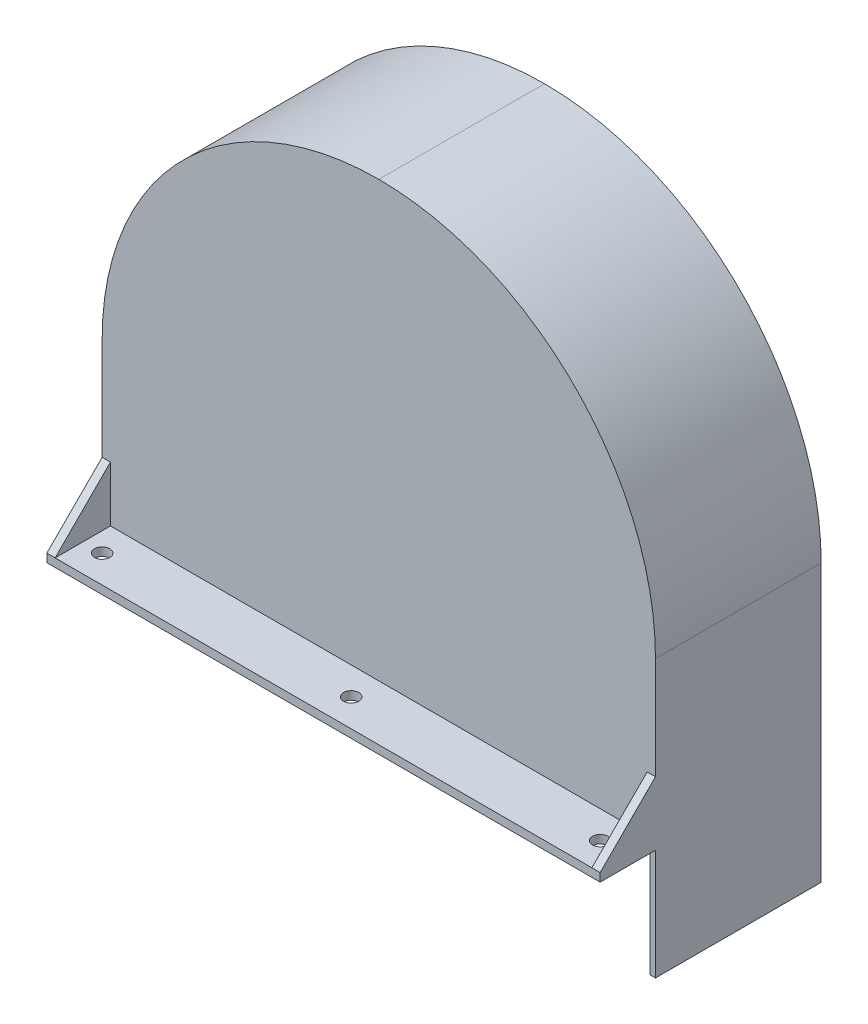
ISO-10303-21;
HEADER;
FILE_DESCRIPTION(('STEP AP214'),'2;1');
FILE_NAME('part.step','',(''),(''),'','','');
FILE_SCHEMA(('AUTOMOTIVE_DESIGN { 1 0 10303 214 1 1 1 1 }'));
ENDSEC;
DATA;
#1=APPLICATION_CONTEXT('core data for automotive mechanical design processes');
#2=APPLICATION_PROTOCOL_DEFINITION('international standard','automotive_design',2000,#1);
#3=PRODUCT_CONTEXT('',#1,'mechanical');
#4=PRODUCT('Part','Part','',(#3));
#5=PRODUCT_RELATED_PRODUCT_CATEGORY('part','',(#4));
#6=PRODUCT_DEFINITION_FORMATION('','',#4);
#7=PRODUCT_DEFINITION_CONTEXT('part definition',#1,'design');
#8=PRODUCT_DEFINITION('design','',#6,#7);
#9=PRODUCT_DEFINITION_SHAPE('','',#8);
#10=(LENGTH_UNIT() NAMED_UNIT(*) SI_UNIT(.MILLI.,.METRE.));
#11=(NAMED_UNIT(*) PLANE_ANGLE_UNIT() SI_UNIT($,.RADIAN.));
#12=(NAMED_UNIT(*) SI_UNIT($,.STERADIAN.) SOLID_ANGLE_UNIT());
#13=UNCERTAINTY_MEASURE_WITH_UNIT(LENGTH_MEASURE(1.E-05),#10,'distance_accuracy_value','');
#14=(GEOMETRIC_REPRESENTATION_CONTEXT(3) GLOBAL_UNCERTAINTY_ASSIGNED_CONTEXT((#13)) GLOBAL_UNIT_ASSIGNED_CONTEXT((#10,
#11,#12)) REPRESENTATION_CONTEXT('',''));
#15=CARTESIAN_POINT('',(0.,0.,0.));
#16=DIRECTION('',(0.,0.,1.));
#17=DIRECTION('',(1.,0.,0.));
#18=AXIS2_PLACEMENT_3D('',#15,#16,#17);
#19=CARTESIAN_POINT('',(0.,0.,0.));
#20=DIRECTION('',(0.,1.,0.));
#21=DIRECTION('',(0.,0.,1.));
#22=AXIS2_PLACEMENT_3D('',#19,#20,#21);
#23=PLANE('',#22);
#24=DIRECTION('',(0.,0.,-1.));
#25=VECTOR('',#24,1.);
#26=CARTESIAN_POINT('',(98.,0.,-29.945));
#27=LINE('',#26,#25);
#28=CARTESIAN_POINT('',(98.,0.,-27.945));
#29=VERTEX_POINT('',#28);
#30=CARTESIAN_POINT('',(98.,0.,-29.945));
#31=VERTEX_POINT('',#30);
#32=EDGE_CURVE('E11',#29,#31,#27,.T.);
#33=ORIENTED_EDGE('',*,*,#32,.F.);
#34=DIRECTION('',(-1.,0.,0.));
#35=VECTOR('',#34,1.);
#36=CARTESIAN_POINT('',(70.,0.,-27.945));
#37=LINE('',#36,#35);
#38=CARTESIAN_POINT('',(70.,0.,-27.945));
#39=VERTEX_POINT('',#38);
#40=EDGE_CURVE('E273',#29,#39,#37,.T.);
#41=ORIENTED_EDGE('',*,*,#40,.T.);
#42=DIRECTION('',(0.,0.,-1.));
#43=VECTOR('',#42,1.);
#44=CARTESIAN_POINT('',(70.,0.,-27.945));
#45=LINE('',#44,#43);
#46=CARTESIAN_POINT('',(70.,0.,-29.945));
#47=VERTEX_POINT('',#46);
#48=EDGE_CURVE('E286',#39,#47,#45,.T.);
#49=ORIENTED_EDGE('',*,*,#48,.T.);
#50=DIRECTION('',(-1.,0.,0.));
#51=VECTOR('',#50,1.);
#52=CARTESIAN_POINT('',(-100.,0.,-29.945));
#53=LINE('',#52,#51);
#54=EDGE_CURVE('E65',#31,#47,#53,.T.);
#55=ORIENTED_EDGE('',*,*,#54,.F.);
#56=EDGE_LOOP('',(#33,#41,#49,#55));
#57=FACE_BOUND('',#56,.T.);
#58=ADVANCED_FACE('F40',(#57),#23,.F.);
#59=CARTESIAN_POINT('',(0.,0.,39.945));
#60=DIRECTION('',(0.,1.,0.));
#61=DIRECTION('',(0.,0.,1.));
#62=AXIS2_PLACEMENT_3D('',#59,#60,#61);
#63=CIRCLE('',#62,2.75);
#64=CARTESIAN_POINT('',(0.,0.,42.695));
#65=VERTEX_POINT('',#64);
#66=EDGE_CURVE('E250',#65,#65,#63,.F.);
#67=ORIENTED_EDGE('',*,*,#66,.F.);
#68=EDGE_LOOP('',(#67));
#69=FACE_BOUND('',#68,.T.);
#70=CARTESIAN_POINT('',(90.,0.,39.945));
#71=DIRECTION('',(0.,1.,0.));
#72=DIRECTION('',(0.,0.,1.));
#73=AXIS2_PLACEMENT_3D('',#70,#71,#72);
#74=CIRCLE('',#73,2.75000000000001);
#75=CARTESIAN_POINT('',(90.,0.,42.695));
#76=VERTEX_POINT('',#75);
#77=EDGE_CURVE('E242',#76,#76,#74,.F.);
#78=ORIENTED_EDGE('',*,*,#77,.F.);
#79=EDGE_LOOP('',(#78));
#80=FACE_BOUND('',#79,.T.);
#81=CARTESIAN_POINT('',(-90.,0.,39.945));
#82=DIRECTION('',(0.,1.,0.));
#83=DIRECTION('',(0.,0.,1.));
#84=AXIS2_PLACEMENT_3D('',#81,#82,#83);
#85=CIRCLE('',#84,2.75000000000001);
#86=CARTESIAN_POINT('',(-90.,0.,42.695));
#87=VERTEX_POINT('',#86);
#88=EDGE_CURVE('E233',#87,#87,#85,.F.);
#89=ORIENTED_EDGE('',*,*,#88,.F.);
#90=EDGE_LOOP('',(#89));
#91=FACE_BOUND('',#90,.T.);
#92=CARTESIAN_POINT('',(98.,0.,29.945));
#93=VERTEX_POINT('',#92);
#94=CARTESIAN_POINT('',(98.,0.,27.945));
#95=VERTEX_POINT('',#94);
#96=EDGE_CURVE('E50',#93,#95,#27,.T.);
#97=ORIENTED_EDGE('',*,*,#96,.F.);
#98=DIRECTION('',(-1.,0.,0.));
#99=VECTOR('',#98,1.);
#100=CARTESIAN_POINT('',(100.,0.,29.945));
#101=LINE('',#100,#99);
#102=CARTESIAN_POINT('',(100.,0.,29.945));
#103=VERTEX_POINT('',#102);
#104=EDGE_CURVE('E57',#103,#93,#101,.T.);
#105=ORIENTED_EDGE('',*,*,#104,.F.);
#106=DIRECTION('',(0.,0.,-1.));
#107=VECTOR('',#106,1.);
#108=CARTESIAN_POINT('',(100.,0.,-29.945));
#109=LINE('',#108,#107);
#110=CARTESIAN_POINT('',(100.,0.,49.945));
#111=VERTEX_POINT('',#110);
#112=EDGE_CURVE('E229',#111,#103,#109,.T.);
#113=ORIENTED_EDGE('',*,*,#112,.F.);
#114=DIRECTION('',(1.,0.,0.));
#115=VECTOR('',#114,1.);
#116=CARTESIAN_POINT('',(100.,0.,49.945));
#117=LINE('',#116,#115);
#118=CARTESIAN_POINT('',(-100.,0.,49.945));
#119=VERTEX_POINT('',#118);
#120=EDGE_CURVE('E337',#119,#111,#117,.T.);
#121=ORIENTED_EDGE('',*,*,#120,.F.);
#122=DIRECTION('',(0.,0.,1.));
#123=VECTOR('',#122,1.);
#124=CARTESIAN_POINT('',(-100.,0.,-29.945));
#125=LINE('',#124,#123);
#126=CARTESIAN_POINT('',(-100.,0.,-29.945));
#127=VERTEX_POINT('',#126);
#128=EDGE_CURVE('E362',#127,#119,#125,.T.);
#129=ORIENTED_EDGE('',*,*,#128,.F.);
#130=CARTESIAN_POINT('',(-50.,0.,-29.945));
#131=VERTEX_POINT('',#130);
#132=EDGE_CURVE('E360',#131,#127,#53,.T.);
#133=ORIENTED_EDGE('',*,*,#132,.F.);
#134=DIRECTION('',(0.,0.,-1.));
#135=VECTOR('',#134,1.);
#136=CARTESIAN_POINT('',(-50.,0.,-27.945));
#137=LINE('',#136,#135);
#138=CARTESIAN_POINT('',(-50.,0.,-27.945));
#139=VERTEX_POINT('',#138);
#140=EDGE_CURVE('E295',#139,#131,#137,.T.);
#141=ORIENTED_EDGE('',*,*,#140,.F.);
#142=DIRECTION('',(-1.,0.,0.));
#143=VECTOR('',#142,1.);
#144=CARTESIAN_POINT('',(-50.,0.,-27.945));
#145=LINE('',#144,#143);
#146=CARTESIAN_POINT('',(-61.,0.,-27.945));
#147=VERTEX_POINT('',#146);
#148=EDGE_CURVE('E262',#139,#147,#145,.T.);
#149=ORIENTED_EDGE('',*,*,#148,.T.);
#150=DIRECTION('',(0.,0.,-1.));
#151=VECTOR('',#150,1.);
#152=CARTESIAN_POINT('',(-61.,0.,101.945000000001));
#153=LINE('',#152,#151);
#154=CARTESIAN_POINT('',(-61.,0.,27.945));
#155=VERTEX_POINT('',#154);
#156=EDGE_CURVE('E255',#155,#147,#153,.T.);
#157=ORIENTED_EDGE('',*,*,#156,.F.);
#158=DIRECTION('',(1.,0.,0.));
#159=VECTOR('',#158,1.);
#160=CARTESIAN_POINT('',(-100.,0.,27.945));
#161=LINE('',#160,#159);
#162=EDGE_CURVE('E351',#155,#95,#161,.T.);
#163=ORIENTED_EDGE('',*,*,#162,.T.);
#164=EDGE_LOOP('',(#97,#105,#113,#121,#129,#133,#141,#149,#157,#163));
#165=FACE_BOUND('',#164,.T.);
#166=ADVANCED_FACE('F439',(#69,#80,#91,#165),#23,.F.);
#167=CARTESIAN_POINT('',(0.,60.,0.));
#168=DIRECTION('',(0.,0.,-1.));
#169=DIRECTION('',(-1.,0.,0.));
#170=AXIS2_PLACEMENT_3D('',#167,#168,#169);
#171=CYLINDRICAL_SURFACE('',#170,98.);
#172=DIRECTION('',(0.,0.,-1.));
#173=VECTOR('',#172,1.);
#174=CARTESIAN_POINT('',(-97.9204405296046,63.9480788351011,0.));
#175=LINE('',#174,#173);
#176=CARTESIAN_POINT('',(-97.9204405296046,63.9480788351012,-27.945));
#177=VERTEX_POINT('',#176);
#178=CARTESIAN_POINT('',(-97.9204405296046,63.9480788351011,27.945));
#179=VERTEX_POINT('',#178);
#180=EDGE_CURVE('E259',#177,#179,#175,.F.);
#181=ORIENTED_EDGE('',*,*,#180,.F.);
#182=CARTESIAN_POINT('',(0.,60.,-27.945));
#183=DIRECTION('',(0.,0.,-1.));
#184=DIRECTION('',(-1.,0.,0.));
#185=AXIS2_PLACEMENT_3D('',#182,#183,#184);
#186=CIRCLE('',#185,98.);
#187=CARTESIAN_POINT('',(0.,158.,-27.945));
#188=VERTEX_POINT('',#187);
#189=EDGE_CURVE('E267',#177,#188,#186,.T.);
#190=ORIENTED_EDGE('',*,*,#189,.T.);
#191=DIRECTION('',(0.,0.,-1.));
#192=VECTOR('',#191,1.);
#193=CARTESIAN_POINT('',(0.,158.,0.));
#194=LINE('',#193,#192);
#195=CARTESIAN_POINT('',(0.,158.,27.945));
#196=VERTEX_POINT('',#195);
#197=EDGE_CURVE('E340',#196,#188,#194,.T.);
#198=ORIENTED_EDGE('',*,*,#197,.F.);
#199=CARTESIAN_POINT('',(0.,60.,27.945));
#200=DIRECTION('',(0.,0.,-1.));
#201=DIRECTION('',(-1.,0.,0.));
#202=AXIS2_PLACEMENT_3D('',#199,#200,#201);
#203=CIRCLE('',#202,98.);
#204=EDGE_CURVE('E346',#196,#179,#203,.F.);
#205=ORIENTED_EDGE('',*,*,#204,.T.);
#206=EDGE_LOOP('',(#181,#190,#198,#205));
#207=FACE_BOUND('',#206,.T.);
#208=ADVANCED_FACE('F498',(#207),#171,.F.);
#209=CARTESIAN_POINT('',(-100.,160.,27.945));
#210=DIRECTION('',(0.,0.,-1.));
#211=DIRECTION('',(-1.,0.,0.));
#212=AXIS2_PLACEMENT_3D('',#209,#210,#211);
#213=PLANE('',#212);
#214=ORIENTED_EDGE('',*,*,#162,.F.);
#215=DIRECTION('',(0.499999999999995,-0.866025403784442,0.));
#216=VECTOR('',#215,1.);
#217=CARTESIAN_POINT('',(-61.,0.,27.945));
#218=LINE('',#217,#216);
#219=EDGE_CURVE('E257',#179,#155,#218,.T.);
#220=ORIENTED_EDGE('',*,*,#219,.F.);
#221=ORIENTED_EDGE('',*,*,#204,.F.);
#222=CARTESIAN_POINT('',(0.,60.,27.945));
#223=DIRECTION('',(0.,0.,-1.));
#224=DIRECTION('',(-1.,0.,0.));
#225=AXIS2_PLACEMENT_3D('',#222,#223,#224);
#226=CIRCLE('',#225,98.);
#227=CARTESIAN_POINT('',(98.,60.,27.945));
#228=VERTEX_POINT('',#227);
#229=EDGE_CURVE('E350',#228,#196,#226,.F.);
#230=ORIENTED_EDGE('',*,*,#229,.F.);
#231=DIRECTION('',(0.,-1.,0.));
#232=VECTOR('',#231,1.);
#233=CARTESIAN_POINT('',(98.,160.,27.945));
#234=LINE('',#233,#232);
#235=EDGE_CURVE('E347',#228,#95,#234,.T.);
#236=ORIENTED_EDGE('',*,*,#235,.T.);
#237=EDGE_LOOP('',(#214,#220,#221,#230,#236));
#238=FACE_BOUND('',#237,.T.);
#239=ADVANCED_FACE('F528',(#238),#213,.T.);
#240=CARTESIAN_POINT('',(0.,60.,-27.945));
#241=DIRECTION('',(0.,0.,-1.));
#242=DIRECTION('',(-1.,0.,0.));
#243=AXIS2_PLACEMENT_3D('',#240,#241,#242);
#244=PLANE('',#243);
#245=DIRECTION('',(-0.499999999999995,0.866025403784441,0.));
#246=VECTOR('',#245,1.);
#247=CARTESIAN_POINT('',(-61.,0.,-27.945));
#248=LINE('',#247,#246);
#249=EDGE_CURVE('E253',#147,#177,#248,.T.);
#250=ORIENTED_EDGE('',*,*,#249,.F.);
#251=ORIENTED_EDGE('',*,*,#148,.F.);
#252=DIRECTION('',(0.,-1.,0.));
#253=VECTOR('',#252,1.);
#254=CARTESIAN_POINT('',(-50.,110.,-27.945));
#255=LINE('',#254,#253);
#256=CARTESIAN_POINT('',(-50.,90.,-27.945));
#257=VERTEX_POINT('',#256);
#258=EDGE_CURVE('E283',#257,#139,#255,.T.);
#259=ORIENTED_EDGE('',*,*,#258,.F.);
#260=CARTESIAN_POINT('',(-30.,90.,-27.945));
#261=DIRECTION('',(0.,0.,-1.));
#262=DIRECTION('',(-1.,0.,0.));
#263=AXIS2_PLACEMENT_3D('',#260,#261,#262);
#264=CIRCLE('',#263,20.);
#265=CARTESIAN_POINT('',(-30.,110.,-27.945));
#266=VERTEX_POINT('',#265);
#267=EDGE_CURVE('E406',#257,#266,#264,.T.);
#268=ORIENTED_EDGE('',*,*,#267,.T.);
#269=DIRECTION('',(-1.,0.,0.));
#270=VECTOR('',#269,1.);
#271=CARTESIAN_POINT('',(-50.,110.,-27.945));
#272=LINE('',#271,#270);
#273=CARTESIAN_POINT('',(50.,110.,-27.945));
#274=VERTEX_POINT('',#273);
#275=EDGE_CURVE('E279',#274,#266,#272,.T.);
#276=ORIENTED_EDGE('',*,*,#275,.F.);
#277=CARTESIAN_POINT('',(50.,90.,-27.945));
#278=DIRECTION('',(0.,0.,-1.));
#279=DIRECTION('',(-1.,0.,0.));
#280=AXIS2_PLACEMENT_3D('',#277,#278,#279);
#281=CIRCLE('',#280,20.);
#282=CARTESIAN_POINT('',(70.,90.,-27.945));
#283=VERTEX_POINT('',#282);
#284=EDGE_CURVE('E44',#274,#283,#281,.T.);
#285=ORIENTED_EDGE('',*,*,#284,.T.);
#286=DIRECTION('',(0.,1.,0.));
#287=VECTOR('',#286,1.);
#288=CARTESIAN_POINT('',(70.,110.,-27.945));
#289=LINE('',#288,#287);
#290=EDGE_CURVE('E276',#39,#283,#289,.T.);
#291=ORIENTED_EDGE('',*,*,#290,.F.);
#292=ORIENTED_EDGE('',*,*,#40,.F.);
#293=DIRECTION('',(0.,-1.,0.));
#294=VECTOR('',#293,1.);
#295=CARTESIAN_POINT('',(98.,0.,-27.945));
#296=LINE('',#295,#294);
#297=CARTESIAN_POINT('',(98.,60.,-27.945));
#298=VERTEX_POINT('',#297);
#299=EDGE_CURVE('E270',#298,#29,#296,.T.);
#300=ORIENTED_EDGE('',*,*,#299,.F.);
#301=EDGE_CURVE('E265',#188,#298,#186,.T.);
#302=ORIENTED_EDGE('',*,*,#301,.F.);
#303=ORIENTED_EDGE('',*,*,#189,.F.);
#304=EDGE_LOOP('',(#250,#251,#259,#268,#276,#285,#291,#292,#300,#302,#303));
#305=FACE_BOUND('',#304,.T.);
#306=ADVANCED_FACE('F416',(#305),#244,.F.);
#307=CARTESIAN_POINT('',(98.,160.,-29.945));
#308=DIRECTION('',(-1.,0.,0.));
#309=DIRECTION('',(0.,0.,1.));
#310=AXIS2_PLACEMENT_3D('',#307,#308,#309);
#311=PLANE('',#310);
#312=DIRECTION('',(0.,0.,1.));
#313=VECTOR('',#312,1.);
#314=CARTESIAN_POINT('',(98.,60.,-29.945));
#315=LINE('',#314,#313);
#316=EDGE_CURVE('E343',#298,#228,#315,.T.);
#317=ORIENTED_EDGE('',*,*,#316,.F.);
#318=ORIENTED_EDGE('',*,*,#299,.T.);
#319=ORIENTED_EDGE('',*,*,#32,.T.);
#320=DIRECTION('',(0.,1.,0.));
#321=VECTOR('',#320,1.);
#322=CARTESIAN_POINT('',(98.,-40.,-29.945));
#323=LINE('',#322,#321);
#324=CARTESIAN_POINT('',(98.,-40.,-29.945));
#325=VERTEX_POINT('',#324);
#326=EDGE_CURVE('E235',#325,#31,#323,.T.);
#327=ORIENTED_EDGE('',*,*,#326,.F.);
#328=DIRECTION('',(0.,0.,-1.));
#329=VECTOR('',#328,1.);
#330=CARTESIAN_POINT('',(98.,-40.,-29.945));
#331=LINE('',#330,#329);
#332=CARTESIAN_POINT('',(98.,-40.,29.945));
#333=VERTEX_POINT('',#332);
#334=EDGE_CURVE('E215',#333,#325,#331,.T.);
#335=ORIENTED_EDGE('',*,*,#334,.F.);
#336=DIRECTION('',(0.,1.,0.));
#337=VECTOR('',#336,1.);
#338=CARTESIAN_POINT('',(98.,-40.,29.945));
#339=LINE('',#338,#337);
#340=EDGE_CURVE('E212',#333,#93,#339,.T.);
#341=ORIENTED_EDGE('',*,*,#340,.T.);
#342=ORIENTED_EDGE('',*,*,#96,.T.);
#343=ORIENTED_EDGE('',*,*,#235,.F.);
#344=EDGE_LOOP('',(#317,#318,#319,#327,#335,#341,#342,#343));
#345=FACE_BOUND('',#344,.T.);
#346=ADVANCED_FACE('F527',(#345),#311,.T.);
#347=CARTESIAN_POINT('',(0.,60.,0.));
#348=DIRECTION('',(0.,0.,1.));
#349=DIRECTION('',(1.,0.,0.));
#350=AXIS2_PLACEMENT_3D('',#347,#348,#349);
#351=CYLINDRICAL_SURFACE('',#350,98.);
#352=ORIENTED_EDGE('',*,*,#301,.T.);
#353=ORIENTED_EDGE('',*,*,#316,.T.);
#354=ORIENTED_EDGE('',*,*,#229,.T.);
#355=ORIENTED_EDGE('',*,*,#197,.T.);
#356=EDGE_LOOP('',(#352,#353,#354,#355));
#357=FACE_BOUND('',#356,.T.);
#358=ADVANCED_FACE('F610',(#357),#351,.F.);
#359=CARTESIAN_POINT('',(100.,3.,49.945));
#360=DIRECTION('',(0.,-1.,0.));
#361=DIRECTION('',(1.,0.,0.));
#362=AXIS2_PLACEMENT_3D('',#359,#360,#361);
#363=PLANE('',#362);
#364=CARTESIAN_POINT('',(-90.,2.99999999999998,39.945));
#365=DIRECTION('',(0.,1.,0.));
#366=DIRECTION('',(-1.,0.,0.));
#367=AXIS2_PLACEMENT_3D('',#364,#365,#366);
#368=CIRCLE('',#367,2.75000000000001);
#369=CARTESIAN_POINT('',(-92.75,2.99999999999998,39.945));
#370=VERTEX_POINT('',#369);
#371=EDGE_CURVE('E230',#370,#370,#368,.T.);
#372=ORIENTED_EDGE('',*,*,#371,.F.);
#373=EDGE_LOOP('',(#372));
#374=FACE_BOUND('',#373,.T.);
#375=CARTESIAN_POINT('',(90.,3.,39.945));
#376=DIRECTION('',(0.,1.,0.));
#377=DIRECTION('',(-1.,0.,0.));
#378=AXIS2_PLACEMENT_3D('',#375,#376,#377);
#379=CIRCLE('',#378,2.75000000000001);
#380=CARTESIAN_POINT('',(87.25,3.,39.945));
#381=VERTEX_POINT('',#380);
#382=EDGE_CURVE('E239',#381,#381,#379,.T.);
#383=ORIENTED_EDGE('',*,*,#382,.F.);
#384=EDGE_LOOP('',(#383));
#385=FACE_BOUND('',#384,.T.);
#386=CARTESIAN_POINT('',(0.,2.99999999999999,39.945));
#387=DIRECTION('',(0.,1.,0.));
#388=DIRECTION('',(-1.,0.,0.));
#389=AXIS2_PLACEMENT_3D('',#386,#387,#388);
#390=CIRCLE('',#389,2.75);
#391=CARTESIAN_POINT('',(-2.75,2.99999999999999,39.945));
#392=VERTEX_POINT('',#391);
#393=EDGE_CURVE('E244',#392,#392,#390,.T.);
#394=ORIENTED_EDGE('',*,*,#393,.F.);
#395=EDGE_LOOP('',(#394));
#396=FACE_BOUND('',#395,.T.);
#397=DIRECTION('',(0.,0.,-1.));
#398=VECTOR('',#397,1.);
#399=CARTESIAN_POINT('',(-97.,2.99999999999998,29.945));
#400=LINE('',#399,#398);
#401=CARTESIAN_POINT('',(-97.,3.,49.945));
#402=VERTEX_POINT('',#401);
#403=CARTESIAN_POINT('',(-97.,2.99999999999998,29.945));
#404=VERTEX_POINT('',#403);
#405=EDGE_CURVE('E300',#402,#404,#400,.T.);
#406=ORIENTED_EDGE('',*,*,#405,.F.);
#407=DIRECTION('',(-1.,0.,0.));
#408=VECTOR('',#407,1.);
#409=CARTESIAN_POINT('',(100.,3.,49.945));
#410=LINE('',#409,#408);
#411=CARTESIAN_POINT('',(97.,3.,49.945));
#412=VERTEX_POINT('',#411);
#413=EDGE_CURVE('E330',#412,#402,#410,.T.);
#414=ORIENTED_EDGE('',*,*,#413,.F.);
#415=DIRECTION('',(0.,0.,-1.));
#416=VECTOR('',#415,1.);
#417=CARTESIAN_POINT('',(97.,2.99999999999998,29.945));
#418=LINE('',#417,#416);
#419=CARTESIAN_POINT('',(97.,2.99999999999998,29.945));
#420=VERTEX_POINT('',#419);
#421=EDGE_CURVE('E313',#412,#420,#418,.T.);
#422=ORIENTED_EDGE('',*,*,#421,.T.);
#423=DIRECTION('',(-1.,0.,0.));
#424=VECTOR('',#423,1.);
#425=CARTESIAN_POINT('',(100.,3.,29.945));
#426=LINE('',#425,#424);
#427=EDGE_CURVE('E326',#420,#404,#426,.T.);
#428=ORIENTED_EDGE('',*,*,#427,.T.);
#429=EDGE_LOOP('',(#406,#414,#422,#428));
#430=FACE_BOUND('',#429,.T.);
#431=ADVANCED_FACE('F474',(#374,#385,#396,#430),#363,.F.);
#432=CARTESIAN_POINT('',(-100.,160.,29.945));
#433=DIRECTION('',(0.,0.,-1.));
#434=DIRECTION('',(-1.,0.,0.));
#435=AXIS2_PLACEMENT_3D('',#432,#433,#434);
#436=PLANE('',#435);
#437=DIRECTION('',(-1.,0.,0.));
#438=VECTOR('',#437,1.);
#439=CARTESIAN_POINT('',(-97.,23.,29.945));
#440=LINE('',#439,#438);
#441=CARTESIAN_POINT('',(-97.,23.,29.945));
#442=VERTEX_POINT('',#441);
#443=CARTESIAN_POINT('',(-100.,23.,29.945));
#444=VERTEX_POINT('',#443);
#445=EDGE_CURVE('E308',#442,#444,#440,.T.);
#446=ORIENTED_EDGE('',*,*,#445,.F.);
#447=DIRECTION('',(0.,1.,0.));
#448=VECTOR('',#447,1.);
#449=CARTESIAN_POINT('',(-97.,23.,29.945));
#450=LINE('',#449,#448);
#451=EDGE_CURVE('E304',#404,#442,#450,.T.);
#452=ORIENTED_EDGE('',*,*,#451,.F.);
#453=ORIENTED_EDGE('',*,*,#427,.F.);
#454=DIRECTION('',(0.,1.,0.));
#455=VECTOR('',#454,1.);
#456=CARTESIAN_POINT('',(97.,23.,29.945));
#457=LINE('',#456,#455);
#458=CARTESIAN_POINT('',(97.,23.,29.945));
#459=VERTEX_POINT('',#458);
#460=EDGE_CURVE('E316',#420,#459,#457,.T.);
#461=ORIENTED_EDGE('',*,*,#460,.T.);
#462=DIRECTION('',(1.,0.,0.));
#463=VECTOR('',#462,1.);
#464=CARTESIAN_POINT('',(97.,23.,29.945));
#465=LINE('',#464,#463);
#466=CARTESIAN_POINT('',(100.,23.,29.945));
#467=VERTEX_POINT('',#466);
#468=EDGE_CURVE('E321',#459,#467,#465,.T.);
#469=ORIENTED_EDGE('',*,*,#468,.T.);
#470=DIRECTION('',(0.,-1.,0.));
#471=VECTOR('',#470,1.);
#472=CARTESIAN_POINT('',(100.,160.,29.945));
#473=LINE('',#472,#471);
#474=CARTESIAN_POINT('',(100.,60.,29.945));
#475=VERTEX_POINT('',#474);
#476=EDGE_CURVE('E364',#475,#467,#473,.T.);
#477=ORIENTED_EDGE('',*,*,#476,.F.);
#478=CARTESIAN_POINT('',(0.,60.,29.945));
#479=DIRECTION('',(0.,0.,-1.));
#480=DIRECTION('',(-1.,0.,0.));
#481=AXIS2_PLACEMENT_3D('',#478,#479,#480);
#482=CIRCLE('',#481,100.);
#483=CARTESIAN_POINT('',(0.,160.,29.945));
#484=VERTEX_POINT('',#483);
#485=EDGE_CURVE('E374',#475,#484,#482,.F.);
#486=ORIENTED_EDGE('',*,*,#485,.T.);
#487=CARTESIAN_POINT('',(0.,60.,29.945));
#488=DIRECTION('',(0.,0.,-1.));
#489=DIRECTION('',(-1.,0.,0.));
#490=AXIS2_PLACEMENT_3D('',#487,#488,#489);
#491=CIRCLE('',#490,100.);
#492=CARTESIAN_POINT('',(-100.,60.,29.945));
#493=VERTEX_POINT('',#492);
#494=EDGE_CURVE('E377',#484,#493,#491,.F.);
#495=ORIENTED_EDGE('',*,*,#494,.T.);
#496=DIRECTION('',(0.,-1.,0.));
#497=VECTOR('',#496,1.);
#498=CARTESIAN_POINT('',(-100.,160.,29.945));
#499=LINE('',#498,#497);
#500=EDGE_CURVE('E366',#493,#444,#499,.T.);
#501=ORIENTED_EDGE('',*,*,#500,.T.);
#502=EDGE_LOOP('',(#446,#452,#453,#461,#469,#477,#486,#495,#501));
#503=FACE_BOUND('',#502,.T.);
#504=ADVANCED_FACE('F462',(#503),#436,.F.);
#505=CARTESIAN_POINT('',(100.,160.,-29.945));
#506=DIRECTION('',(-1.,0.,0.));
#507=DIRECTION('',(0.,0.,1.));
#508=AXIS2_PLACEMENT_3D('',#505,#506,#507);
#509=PLANE('',#508);
#510=ORIENTED_EDGE('',*,*,#476,.T.);
#511=DIRECTION('',(0.,-0.707106781186547,0.707106781186548));
#512=VECTOR('',#511,1.);
#513=CARTESIAN_POINT('',(100.,3.,49.945));
#514=LINE('',#513,#512);
#515=CARTESIAN_POINT('',(100.,3.,49.945));
#516=VERTEX_POINT('',#515);
#517=EDGE_CURVE('E310',#467,#516,#514,.T.);
#518=ORIENTED_EDGE('',*,*,#517,.T.);
#519=DIRECTION('',(0.,1.,0.));
#520=VECTOR('',#519,1.);
#521=CARTESIAN_POINT('',(100.,0.,49.945));
#522=LINE('',#521,#520);
#523=EDGE_CURVE('E327',#111,#516,#522,.T.);
#524=ORIENTED_EDGE('',*,*,#523,.F.);
#525=ORIENTED_EDGE('',*,*,#112,.T.);
#526=DIRECTION('',(0.,1.,0.));
#527=VECTOR('',#526,1.);
#528=CARTESIAN_POINT('',(100.,-40.,29.945));
#529=LINE('',#528,#527);
#530=CARTESIAN_POINT('',(100.,-40.,29.945));
#531=VERTEX_POINT('',#530);
#532=EDGE_CURVE('E210',#531,#103,#529,.T.);
#533=ORIENTED_EDGE('',*,*,#532,.F.);
#534=DIRECTION('',(0.,0.,1.));
#535=VECTOR('',#534,1.);
#536=CARTESIAN_POINT('',(100.,-40.,-29.945));
#537=LINE('',#536,#535);
#538=CARTESIAN_POINT('',(100.,-40.,-29.945));
#539=VERTEX_POINT('',#538);
#540=EDGE_CURVE('E216',#539,#531,#537,.T.);
#541=ORIENTED_EDGE('',*,*,#540,.F.);
#542=DIRECTION('',(0.,-1.,0.));
#543=VECTOR('',#542,1.);
#544=CARTESIAN_POINT('',(100.,160.,-29.945));
#545=LINE('',#544,#543);
#546=CARTESIAN_POINT('',(100.,60.,-29.945));
#547=VERTEX_POINT('',#546);
#548=EDGE_CURVE('E372',#547,#539,#545,.T.);
#549=ORIENTED_EDGE('',*,*,#548,.F.);
#550=DIRECTION('',(0.,0.,-1.));
#551=VECTOR('',#550,1.);
#552=CARTESIAN_POINT('',(100.,60.,29.945));
#553=LINE('',#552,#551);
#554=EDGE_CURVE('E387',#547,#475,#553,.F.);
#555=ORIENTED_EDGE('',*,*,#554,.T.);
#556=EDGE_LOOP('',(#510,#518,#524,#525,#533,#541,#549,#555));
#557=FACE_BOUND('',#556,.T.);
#558=ADVANCED_FACE('F227',(#557),#509,.F.);
#559=CARTESIAN_POINT('',(-100.,160.,-29.945));
#560=DIRECTION('',(0.,0.,1.));
#561=DIRECTION('',(1.,0.,0.));
#562=AXIS2_PLACEMENT_3D('',#559,#560,#561);
#563=PLANE('',#562);
#564=ORIENTED_EDGE('',*,*,#548,.T.);
#565=DIRECTION('',(1.,0.,0.));
#566=VECTOR('',#565,1.);
#567=CARTESIAN_POINT('',(100.,-40.,-29.945));
#568=LINE('',#567,#566);
#569=EDGE_CURVE('E222',#325,#539,#568,.T.);
#570=ORIENTED_EDGE('',*,*,#569,.F.);
#571=ORIENTED_EDGE('',*,*,#326,.T.);
#572=ORIENTED_EDGE('',*,*,#54,.T.);
#573=DIRECTION('',(0.,1.,0.));
#574=VECTOR('',#573,1.);
#575=CARTESIAN_POINT('',(70.,110.,-29.945));
#576=LINE('',#575,#574);
#577=CARTESIAN_POINT('',(70.,90.,-29.945));
#578=VERTEX_POINT('',#577);
#579=EDGE_CURVE('E261',#47,#578,#576,.T.);
#580=ORIENTED_EDGE('',*,*,#579,.T.);
#581=CARTESIAN_POINT('',(50.,90.,-29.945));
#582=DIRECTION('',(0.,0.,1.));
#583=DIRECTION('',(1.,0.,0.));
#584=AXIS2_PLACEMENT_3D('',#581,#582,#583);
#585=CIRCLE('',#584,20.);
#586=CARTESIAN_POINT('',(50.,110.,-29.945));
#587=VERTEX_POINT('',#586);
#588=EDGE_CURVE('E408',#578,#587,#585,.T.);
#589=ORIENTED_EDGE('',*,*,#588,.T.);
#590=DIRECTION('',(-1.,0.,0.));
#591=VECTOR('',#590,1.);
#592=CARTESIAN_POINT('',(-50.,110.,-29.945));
#593=LINE('',#592,#591);
#594=CARTESIAN_POINT('',(-30.,110.,-29.945));
#595=VERTEX_POINT('',#594);
#596=EDGE_CURVE('E289',#587,#595,#593,.T.);
#597=ORIENTED_EDGE('',*,*,#596,.T.);
#598=CARTESIAN_POINT('',(-30.,90.,-29.945));
#599=DIRECTION('',(0.,0.,1.));
#600=DIRECTION('',(1.,0.,0.));
#601=AXIS2_PLACEMENT_3D('',#598,#599,#600);
#602=CIRCLE('',#601,20.);
#603=CARTESIAN_POINT('',(-50.,90.,-29.945));
#604=VERTEX_POINT('',#603);
#605=EDGE_CURVE('E403',#595,#604,#602,.T.);
#606=ORIENTED_EDGE('',*,*,#605,.T.);
#607=DIRECTION('',(0.,-1.,0.));
#608=VECTOR('',#607,1.);
#609=CARTESIAN_POINT('',(-50.,110.,-29.945));
#610=LINE('',#609,#608);
#611=EDGE_CURVE('E266',#604,#131,#610,.T.);
#612=ORIENTED_EDGE('',*,*,#611,.T.);
#613=ORIENTED_EDGE('',*,*,#132,.T.);
#614=DIRECTION('',(0.,-1.,0.));
#615=VECTOR('',#614,1.);
#616=CARTESIAN_POINT('',(-100.,160.,-29.945));
#617=LINE('',#616,#615);
#618=CARTESIAN_POINT('',(-100.,60.,-29.945));
#619=VERTEX_POINT('',#618);
#620=EDGE_CURVE('E369',#619,#127,#617,.T.);
#621=ORIENTED_EDGE('',*,*,#620,.F.);
#622=CARTESIAN_POINT('',(0.,60.,-29.945));
#623=DIRECTION('',(0.,0.,1.));
#624=DIRECTION('',(1.,0.,0.));
#625=AXIS2_PLACEMENT_3D('',#622,#623,#624);
#626=CIRCLE('',#625,100.);
#627=CARTESIAN_POINT('',(0.,160.,-29.945));
#628=VERTEX_POINT('',#627);
#629=EDGE_CURVE('E384',#619,#628,#626,.F.);
#630=ORIENTED_EDGE('',*,*,#629,.T.);
#631=CARTESIAN_POINT('',(0.,60.,-29.945));
#632=DIRECTION('',(0.,0.,1.));
#633=DIRECTION('',(1.,0.,0.));
#634=AXIS2_PLACEMENT_3D('',#631,#632,#633);
#635=CIRCLE('',#634,100.);
#636=EDGE_CURVE('E382',#628,#547,#635,.F.);
#637=ORIENTED_EDGE('',*,*,#636,.T.);
#638=EDGE_LOOP('',(#564,#570,#571,#572,#580,#589,#597,#606,#612,#613,#621,#630,#637));
#639=FACE_BOUND('',#638,.T.);
#640=ADVANCED_FACE('F427',(#639),#563,.F.);
#641=CARTESIAN_POINT('',(-100.,160.,-29.945));
#642=DIRECTION('',(1.,0.,0.));
#643=DIRECTION('',(0.,0.,-1.));
#644=AXIS2_PLACEMENT_3D('',#641,#642,#643);
#645=PLANE('',#644);
#646=ORIENTED_EDGE('',*,*,#500,.F.);
#647=DIRECTION('',(0.,0.,1.));
#648=VECTOR('',#647,1.);
#649=CARTESIAN_POINT('',(-100.,60.,-29.945));
#650=LINE('',#649,#648);
#651=EDGE_CURVE('E379',#493,#619,#650,.F.);
#652=ORIENTED_EDGE('',*,*,#651,.T.);
#653=ORIENTED_EDGE('',*,*,#620,.T.);
#654=ORIENTED_EDGE('',*,*,#128,.T.);
#655=DIRECTION('',(0.,-1.,0.));
#656=VECTOR('',#655,1.);
#657=CARTESIAN_POINT('',(-100.,0.,49.945));
#658=LINE('',#657,#656);
#659=CARTESIAN_POINT('',(-100.,2.99999999999998,49.945));
#660=VERTEX_POINT('',#659);
#661=EDGE_CURVE('E334',#660,#119,#658,.T.);
#662=ORIENTED_EDGE('',*,*,#661,.F.);
#663=DIRECTION('',(0.,-0.707106781186547,0.707106781186548));
#664=VECTOR('',#663,1.);
#665=CARTESIAN_POINT('',(-100.,3.,49.945));
#666=LINE('',#665,#664);
#667=EDGE_CURVE('E298',#444,#660,#666,.T.);
#668=ORIENTED_EDGE('',*,*,#667,.F.);
#669=EDGE_LOOP('',(#646,#652,#653,#654,#662,#668));
#670=FACE_BOUND('',#669,.T.);
#671=ADVANCED_FACE('F446',(#670),#645,.F.);
#672=CARTESIAN_POINT('',(0.,60.,0.));
#673=DIRECTION('',(0.,0.,1.));
#674=DIRECTION('',(1.,0.,0.));
#675=AXIS2_PLACEMENT_3D('',#672,#673,#674);
#676=CYLINDRICAL_SURFACE('',#675,100.);
#677=ORIENTED_EDGE('',*,*,#554,.F.);
#678=ORIENTED_EDGE('',*,*,#636,.F.);
#679=DIRECTION('',(0.,0.,-1.));
#680=VECTOR('',#679,1.);
#681=CARTESIAN_POINT('',(0.,160.,-29.945));
#682=LINE('',#681,#680);
#683=EDGE_CURVE('E345',#484,#628,#682,.T.);
#684=ORIENTED_EDGE('',*,*,#683,.F.);
#685=ORIENTED_EDGE('',*,*,#485,.F.);
#686=EDGE_LOOP('',(#677,#678,#684,#685));
#687=FACE_BOUND('',#686,.T.);
#688=ADVANCED_FACE('F457',(#687),#676,.T.);
#689=CARTESIAN_POINT('',(0.,60.,0.));
#690=DIRECTION('',(0.,0.,-1.));
#691=DIRECTION('',(-1.,0.,0.));
#692=AXIS2_PLACEMENT_3D('',#689,#690,#691);
#693=CYLINDRICAL_SURFACE('',#692,100.);
#694=ORIENTED_EDGE('',*,*,#629,.F.);
#695=ORIENTED_EDGE('',*,*,#651,.F.);
#696=ORIENTED_EDGE('',*,*,#494,.F.);
#697=ORIENTED_EDGE('',*,*,#683,.T.);
#698=EDGE_LOOP('',(#694,#695,#696,#697));
#699=FACE_BOUND('',#698,.T.);
#700=ADVANCED_FACE('F452',(#699),#693,.T.);
#701=CARTESIAN_POINT('',(0.,0.,49.945));
#702=DIRECTION('',(0.,0.,1.));
#703=DIRECTION('',(1.,0.,0.));
#704=AXIS2_PLACEMENT_3D('',#701,#702,#703);
#705=PLANE('',#704);
#706=ORIENTED_EDGE('',*,*,#523,.T.);
#707=EDGE_CURVE('E331',#516,#412,#410,.T.);
#708=ORIENTED_EDGE('',*,*,#707,.T.);
#709=ORIENTED_EDGE('',*,*,#413,.T.);
#710=DIRECTION('',(-1.,0.,0.));
#711=VECTOR('',#710,1.);
#712=CARTESIAN_POINT('',(-97.,3.,49.945));
#713=LINE('',#712,#711);
#714=EDGE_CURVE('E306',#402,#660,#713,.T.);
#715=ORIENTED_EDGE('',*,*,#714,.T.);
#716=ORIENTED_EDGE('',*,*,#661,.T.);
#717=ORIENTED_EDGE('',*,*,#120,.T.);
#718=EDGE_LOOP('',(#706,#708,#709,#715,#716,#717));
#719=FACE_BOUND('',#718,.T.);
#720=ADVANCED_FACE('F476',(#719),#705,.T.);
#721=CARTESIAN_POINT('',(97.,3.,49.945));
#722=DIRECTION('',(0.,0.707106781186548,0.707106781186547));
#723=DIRECTION('',(0.,-0.707106781186547,0.707106781186548));
#724=AXIS2_PLACEMENT_3D('',#721,#722,#723);
#725=PLANE('',#724);
#726=ORIENTED_EDGE('',*,*,#517,.F.);
#727=ORIENTED_EDGE('',*,*,#468,.F.);
#728=DIRECTION('',(0.,-0.707106781186547,0.707106781186548));
#729=VECTOR('',#728,1.);
#730=CARTESIAN_POINT('',(97.,3.,49.945));
#731=LINE('',#730,#729);
#732=EDGE_CURVE('E319',#459,#412,#731,.T.);
#733=ORIENTED_EDGE('',*,*,#732,.T.);
#734=ORIENTED_EDGE('',*,*,#707,.F.);
#735=EDGE_LOOP('',(#726,#727,#733,#734));
#736=FACE_BOUND('',#735,.T.);
#737=ADVANCED_FACE('F466',(#736),#725,.T.);
#738=CARTESIAN_POINT('',(97.,0.,0.));
#739=DIRECTION('',(1.,0.,0.));
#740=DIRECTION('',(0.,0.,-1.));
#741=AXIS2_PLACEMENT_3D('',#738,#739,#740);
#742=PLANE('',#741);
#743=ORIENTED_EDGE('',*,*,#421,.F.);
#744=ORIENTED_EDGE('',*,*,#732,.F.);
#745=ORIENTED_EDGE('',*,*,#460,.F.);
#746=EDGE_LOOP('',(#743,#744,#745));
#747=FACE_BOUND('',#746,.T.);
#748=ADVANCED_FACE('F469',(#747),#742,.F.);
#749=CARTESIAN_POINT('',(-97.,3.,49.945));
#750=DIRECTION('',(0.,-0.707106781186548,-0.707106781186547));
#751=DIRECTION('',(0.,0.707106781186547,-0.707106781186548));
#752=AXIS2_PLACEMENT_3D('',#749,#750,#751);
#753=PLANE('',#752);
#754=ORIENTED_EDGE('',*,*,#667,.T.);
#755=ORIENTED_EDGE('',*,*,#714,.F.);
#756=DIRECTION('',(0.,-0.707106781186547,0.707106781186548));
#757=VECTOR('',#756,1.);
#758=CARTESIAN_POINT('',(-97.,3.,49.945));
#759=LINE('',#758,#757);
#760=EDGE_CURVE('E302',#442,#402,#759,.T.);
#761=ORIENTED_EDGE('',*,*,#760,.F.);
#762=ORIENTED_EDGE('',*,*,#445,.T.);
#763=EDGE_LOOP('',(#754,#755,#761,#762));
#764=FACE_BOUND('',#763,.T.);
#765=ADVANCED_FACE('F481',(#764),#753,.F.);
#766=CARTESIAN_POINT('',(-97.,0.,0.));
#767=DIRECTION('',(-1.,0.,0.));
#768=DIRECTION('',(0.,0.,-1.));
#769=AXIS2_PLACEMENT_3D('',#766,#767,#768);
#770=PLANE('',#769);
#771=ORIENTED_EDGE('',*,*,#405,.T.);
#772=ORIENTED_EDGE('',*,*,#451,.T.);
#773=ORIENTED_EDGE('',*,*,#760,.T.);
#774=EDGE_LOOP('',(#771,#772,#773));
#775=FACE_BOUND('',#774,.T.);
#776=ADVANCED_FACE('F483',(#775),#770,.F.);
#777=CARTESIAN_POINT('',(-50.,110.,-27.945));
#778=DIRECTION('',(1.,0.,0.));
#779=DIRECTION('',(0.,1.,0.));
#780=AXIS2_PLACEMENT_3D('',#777,#778,#779);
#781=PLANE('',#780);
#782=ORIENTED_EDGE('',*,*,#611,.F.);
#783=DIRECTION('',(0.,0.,-1.));
#784=VECTOR('',#783,1.);
#785=CARTESIAN_POINT('',(-50.,90.,-27.945));
#786=LINE('',#785,#784);
#787=EDGE_CURVE('E397',#604,#257,#786,.F.);
#788=ORIENTED_EDGE('',*,*,#787,.T.);
#789=ORIENTED_EDGE('',*,*,#258,.T.);
#790=ORIENTED_EDGE('',*,*,#140,.T.);
#791=EDGE_LOOP('',(#782,#788,#789,#790));
#792=FACE_BOUND('',#791,.T.);
#793=ADVANCED_FACE('F433',(#792),#781,.T.);
#794=CARTESIAN_POINT('',(-50.,110.,-27.945));
#795=DIRECTION('',(0.,-1.,0.));
#796=DIRECTION('',(0.,0.,-1.));
#797=AXIS2_PLACEMENT_3D('',#794,#795,#796);
#798=PLANE('',#797);
#799=ORIENTED_EDGE('',*,*,#275,.T.);
#800=DIRECTION('',(0.,0.,-1.));
#801=VECTOR('',#800,1.);
#802=CARTESIAN_POINT('',(-30.,110.,-29.945));
#803=LINE('',#802,#801);
#804=EDGE_CURVE('E393',#266,#595,#803,.T.);
#805=ORIENTED_EDGE('',*,*,#804,.T.);
#806=ORIENTED_EDGE('',*,*,#596,.F.);
#807=DIRECTION('',(0.,0.,-1.));
#808=VECTOR('',#807,1.);
#809=CARTESIAN_POINT('',(50.,110.,-27.945));
#810=LINE('',#809,#808);
#811=EDGE_CURVE('E389',#587,#274,#810,.F.);
#812=ORIENTED_EDGE('',*,*,#811,.T.);
#813=EDGE_LOOP('',(#799,#805,#806,#812));
#814=FACE_BOUND('',#813,.T.);
#815=ADVANCED_FACE('F425',(#814),#798,.T.);
#816=CARTESIAN_POINT('',(70.,110.,-27.945));
#817=DIRECTION('',(-1.,0.,0.));
#818=DIRECTION('',(0.,-1.,0.));
#819=AXIS2_PLACEMENT_3D('',#816,#817,#818);
#820=PLANE('',#819);
#821=ORIENTED_EDGE('',*,*,#290,.T.);
#822=DIRECTION('',(0.,0.,-1.));
#823=VECTOR('',#822,1.);
#824=CARTESIAN_POINT('',(70.,90.,-29.945));
#825=LINE('',#824,#823);
#826=EDGE_CURVE('E400',#283,#578,#825,.T.);
#827=ORIENTED_EDGE('',*,*,#826,.T.);
#828=ORIENTED_EDGE('',*,*,#579,.F.);
#829=ORIENTED_EDGE('',*,*,#48,.F.);
#830=EDGE_LOOP('',(#821,#827,#828,#829));
#831=FACE_BOUND('',#830,.T.);
#832=ADVANCED_FACE('F422',(#831),#820,.T.);
#833=CARTESIAN_POINT('',(-30.,90.,-27.945));
#834=DIRECTION('',(0.,0.,1.));
#835=DIRECTION('',(1.,0.,0.));
#836=AXIS2_PLACEMENT_3D('',#833,#834,#835);
#837=CYLINDRICAL_SURFACE('',#836,20.);
#838=ORIENTED_EDGE('',*,*,#267,.F.);
#839=ORIENTED_EDGE('',*,*,#787,.F.);
#840=ORIENTED_EDGE('',*,*,#605,.F.);
#841=ORIENTED_EDGE('',*,*,#804,.F.);
#842=EDGE_LOOP('',(#838,#839,#840,#841));
#843=FACE_BOUND('',#842,.T.);
#844=ADVANCED_FACE('F437',(#843),#837,.F.);
#845=CARTESIAN_POINT('',(50.,90.,-27.945));
#846=DIRECTION('',(0.,0.,1.));
#847=DIRECTION('',(1.,0.,0.));
#848=AXIS2_PLACEMENT_3D('',#845,#846,#847);
#849=CYLINDRICAL_SURFACE('',#848,20.);
#850=ORIENTED_EDGE('',*,*,#284,.F.);
#851=ORIENTED_EDGE('',*,*,#811,.F.);
#852=ORIENTED_EDGE('',*,*,#588,.F.);
#853=ORIENTED_EDGE('',*,*,#826,.F.);
#854=EDGE_LOOP('',(#850,#851,#852,#853));
#855=FACE_BOUND('',#854,.T.);
#856=ADVANCED_FACE('F42',(#855),#849,.F.);
#857=CARTESIAN_POINT('',(-61.,0.,101.945000000001));
#858=DIRECTION('',(-0.866025403784442,-0.499999999999995,0.));
#859=DIRECTION('',(0.499999999999995,-0.866025403784442,0.));
#860=AXIS2_PLACEMENT_3D('',#857,#858,#859);
#861=PLANE('',#860);
#862=ORIENTED_EDGE('',*,*,#249,.T.);
#863=ORIENTED_EDGE('',*,*,#180,.T.);
#864=ORIENTED_EDGE('',*,*,#219,.T.);
#865=ORIENTED_EDGE('',*,*,#156,.T.);
#866=EDGE_LOOP('',(#862,#863,#864,#865));
#867=FACE_BOUND('',#866,.T.);
#868=ADVANCED_FACE('F519',(#867),#861,.F.);
#869=CARTESIAN_POINT('',(0.,-0.00100000000001531,39.945));
#870=DIRECTION('',(0.,1.,0.));
#871=DIRECTION('',(-1.,0.,0.));
#872=AXIS2_PLACEMENT_3D('',#869,#870,#871);
#873=CYLINDRICAL_SURFACE('',#872,2.75);
#874=ORIENTED_EDGE('',*,*,#393,.T.);
#875=EDGE_LOOP('',(#874));
#876=FACE_BOUND('',#875,.T.);
#877=ORIENTED_EDGE('',*,*,#66,.T.);
#878=EDGE_LOOP('',(#877));
#879=FACE_BOUND('',#878,.T.);
#880=ADVANCED_FACE('F531',(#876,#879),#873,.F.);
#881=CARTESIAN_POINT('',(90.,-0.00100000000000273,39.945));
#882=DIRECTION('',(0.,1.,0.));
#883=DIRECTION('',(-1.,0.,0.));
#884=AXIS2_PLACEMENT_3D('',#881,#882,#883);
#885=CYLINDRICAL_SURFACE('',#884,2.75000000000001);
#886=ORIENTED_EDGE('',*,*,#382,.T.);
#887=EDGE_LOOP('',(#886));
#888=FACE_BOUND('',#887,.T.);
#889=ORIENTED_EDGE('',*,*,#77,.T.);
#890=EDGE_LOOP('',(#889));
#891=FACE_BOUND('',#890,.T.);
#892=ADVANCED_FACE('F535',(#888,#891),#885,.F.);
#893=CARTESIAN_POINT('',(-90.,-0.00100000000002789,39.945));
#894=DIRECTION('',(0.,1.,0.));
#895=DIRECTION('',(-1.,0.,0.));
#896=AXIS2_PLACEMENT_3D('',#893,#894,#895);
#897=CYLINDRICAL_SURFACE('',#896,2.75000000000001);
#898=ORIENTED_EDGE('',*,*,#371,.T.);
#899=EDGE_LOOP('',(#898));
#900=FACE_BOUND('',#899,.T.);
#901=ORIENTED_EDGE('',*,*,#88,.T.);
#902=EDGE_LOOP('',(#901));
#903=FACE_BOUND('',#902,.T.);
#904=ADVANCED_FACE('F537',(#900,#903),#897,.F.);
#905=CARTESIAN_POINT('',(100.,-40.,29.945));
#906=DIRECTION('',(0.,0.,-1.));
#907=DIRECTION('',(-1.,0.,0.));
#908=AXIS2_PLACEMENT_3D('',#905,#906,#907);
#909=PLANE('',#908);
#910=ORIENTED_EDGE('',*,*,#104,.T.);
#911=ORIENTED_EDGE('',*,*,#340,.F.);
#912=DIRECTION('',(-1.,0.,0.));
#913=VECTOR('',#912,1.);
#914=CARTESIAN_POINT('',(100.,-40.,29.945));
#915=LINE('',#914,#913);
#916=EDGE_CURVE('E206',#531,#333,#915,.T.);
#917=ORIENTED_EDGE('',*,*,#916,.F.);
#918=ORIENTED_EDGE('',*,*,#532,.T.);
#919=EDGE_LOOP('',(#910,#911,#917,#918));
#920=FACE_BOUND('',#919,.T.);
#921=ADVANCED_FACE('F208',(#920),#909,.F.);
#922=CARTESIAN_POINT('',(0.,-40.,0.));
#923=DIRECTION('',(0.,-1.,0.));
#924=DIRECTION('',(0.,0.,-1.));
#925=AXIS2_PLACEMENT_3D('',#922,#923,#924);
#926=PLANE('',#925);
#927=ORIENTED_EDGE('',*,*,#540,.T.);
#928=ORIENTED_EDGE('',*,*,#916,.T.);
#929=ORIENTED_EDGE('',*,*,#334,.T.);
#930=ORIENTED_EDGE('',*,*,#569,.T.);
#931=EDGE_LOOP('',(#927,#928,#929,#930));
#932=FACE_BOUND('',#931,.T.);
#933=ADVANCED_FACE('F220',(#932),#926,.T.);
#934=CLOSED_SHELL('',(#58,#166,#208,#239,#306,#346,#358,#431,#504,#558,#640,#671,#688,#700,#720,
#737,#748,#765,#776,#793,#815,#832,#844,#856,#868,#880,#892,#904,#921,#933));
#935=MANIFOLD_SOLID_BREP('B2',#934);
#936=ADVANCED_BREP_SHAPE_REPRESENTATION('',(#18,#935),#14);
#937=SHAPE_DEFINITION_REPRESENTATION(#9,#936);
ENDSEC;
END-ISO-10303-21;
